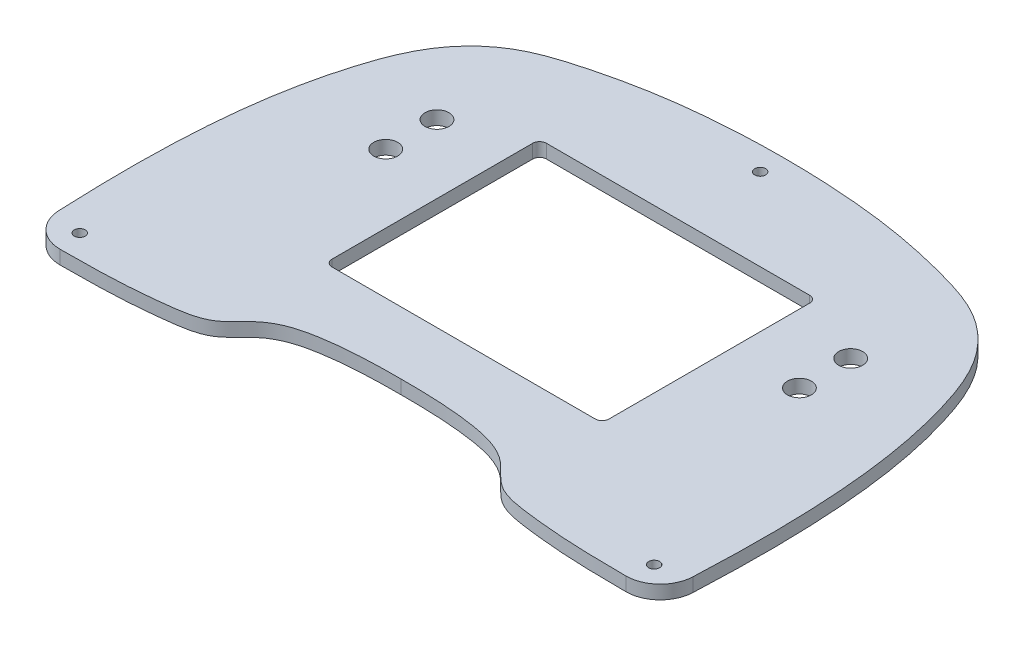
ISO-10303-21;
HEADER;
FILE_DESCRIPTION(('STEP AP214'),'2;1');
FILE_NAME('part.step','',(''),(''),'','','');
FILE_SCHEMA(('AUTOMOTIVE_DESIGN { 1 0 10303 214 1 1 1 1 }'));
ENDSEC;
DATA;
#1=APPLICATION_CONTEXT('core data for automotive mechanical design processes');
#2=APPLICATION_PROTOCOL_DEFINITION('international standard','automotive_design',2000,#1);
#3=PRODUCT_CONTEXT('',#1,'mechanical');
#4=PRODUCT('Part','Part','',(#3));
#5=PRODUCT_RELATED_PRODUCT_CATEGORY('part','',(#4));
#6=PRODUCT_DEFINITION_FORMATION('','',#4);
#7=PRODUCT_DEFINITION_CONTEXT('part definition',#1,'design');
#8=PRODUCT_DEFINITION('design','',#6,#7);
#9=PRODUCT_DEFINITION_SHAPE('','',#8);
#10=(LENGTH_UNIT() NAMED_UNIT(*) SI_UNIT(.MILLI.,.METRE.));
#11=(NAMED_UNIT(*) PLANE_ANGLE_UNIT() SI_UNIT($,.RADIAN.));
#12=(NAMED_UNIT(*) SI_UNIT($,.STERADIAN.) SOLID_ANGLE_UNIT());
#13=UNCERTAINTY_MEASURE_WITH_UNIT(LENGTH_MEASURE(1.E-05),#10,'distance_accuracy_value','');
#14=(GEOMETRIC_REPRESENTATION_CONTEXT(3) GLOBAL_UNCERTAINTY_ASSIGNED_CONTEXT((#13)) GLOBAL_UNIT_ASSIGNED_CONTEXT((#10,
#11,#12)) REPRESENTATION_CONTEXT('',''));
#15=CARTESIAN_POINT('',(0.,0.,0.));
#16=DIRECTION('',(0.,0.,1.));
#17=DIRECTION('',(1.,0.,0.));
#18=AXIS2_PLACEMENT_3D('',#15,#16,#17);
#19=CARTESIAN_POINT('',(0.,0.,0.));
#20=DIRECTION('',(0.,-1.,0.));
#21=DIRECTION('',(0.,0.,-1.));
#22=AXIS2_PLACEMENT_3D('',#19,#20,#21);
#23=PLANE('',#22);
#24=CARTESIAN_POINT('',(-60.5,0.,-97.97));
#25=DIRECTION('',(0.,1.,0.));
#26=DIRECTION('',(0.,0.,-1.));
#27=AXIS2_PLACEMENT_3D('',#24,#25,#26);
#28=CIRCLE('',#27,3.50000000000001);
#29=CARTESIAN_POINT('',(-60.5,0.,-101.47));
#30=VERTEX_POINT('',#29);
#31=EDGE_CURVE('E720',#30,#30,#28,.T.);
#32=ORIENTED_EDGE('',*,*,#31,.T.);
#33=EDGE_LOOP('',(#32));
#34=FACE_BOUND('',#33,.T.);
#35=CARTESIAN_POINT('',(60.5000000000002,0.,-82.97));
#36=DIRECTION('',(0.,1.,0.));
#37=DIRECTION('',(0.,0.,1.));
#38=AXIS2_PLACEMENT_3D('',#35,#36,#37);
#39=CIRCLE('',#38,3.5);
#40=CARTESIAN_POINT('',(60.5000000000002,0.,-79.47));
#41=VERTEX_POINT('',#40);
#42=EDGE_CURVE('E711',#41,#41,#39,.T.);
#43=ORIENTED_EDGE('',*,*,#42,.T.);
#44=EDGE_LOOP('',(#43));
#45=FACE_BOUND('',#44,.T.);
#46=CARTESIAN_POINT('',(-60.5000000000002,0.,-82.97));
#47=DIRECTION('',(0.,1.,0.));
#48=DIRECTION('',(0.,0.,-1.));
#49=AXIS2_PLACEMENT_3D('',#46,#47,#48);
#50=CIRCLE('',#49,3.5);
#51=CARTESIAN_POINT('',(-60.5000000000002,0.,-86.47));
#52=VERTEX_POINT('',#51);
#53=EDGE_CURVE('E727',#52,#52,#50,.T.);
#54=ORIENTED_EDGE('',*,*,#53,.T.);
#55=EDGE_LOOP('',(#54));
#56=FACE_BOUND('',#55,.T.);
#57=CARTESIAN_POINT('',(60.5,0.,-97.97));
#58=DIRECTION('',(0.,1.,0.));
#59=DIRECTION('',(0.,0.,1.));
#60=AXIS2_PLACEMENT_3D('',#57,#58,#59);
#61=CIRCLE('',#60,3.50000000000001);
#62=CARTESIAN_POINT('',(60.5,0.,-94.47));
#63=VERTEX_POINT('',#62);
#64=EDGE_CURVE('E612',#63,#63,#61,.T.);
#65=ORIENTED_EDGE('',*,*,#64,.T.);
#66=EDGE_LOOP('',(#65));
#67=FACE_BOUND('',#66,.T.);
#68=CARTESIAN_POINT('',(-84.,0.,-17.));
#69=DIRECTION('',(0.,1.,0.));
#70=DIRECTION('',(0.,0.,1.));
#71=AXIS2_PLACEMENT_3D('',#68,#69,#70);
#72=CIRCLE('',#71,1.6);
#73=CARTESIAN_POINT('',(-84.,0.,-15.4));
#74=VERTEX_POINT('',#73);
#75=EDGE_CURVE('E620',#74,#74,#72,.T.);
#76=ORIENTED_EDGE('',*,*,#75,.T.);
#77=EDGE_LOOP('',(#76));
#78=FACE_BOUND('',#77,.T.);
#79=CARTESIAN_POINT('',(84.,0.,-17.));
#80=DIRECTION('',(0.,1.,0.));
#81=DIRECTION('',(0.,0.,1.));
#82=AXIS2_PLACEMENT_3D('',#79,#80,#81);
#83=CIRCLE('',#82,1.6);
#84=CARTESIAN_POINT('',(84.,0.,-15.4));
#85=VERTEX_POINT('',#84);
#86=EDGE_CURVE('E604',#85,#85,#83,.T.);
#87=ORIENTED_EDGE('',*,*,#86,.T.);
#88=EDGE_LOOP('',(#87));
#89=FACE_BOUND('',#88,.T.);
#90=CARTESIAN_POINT('',(0.,0.,-132.));
#91=DIRECTION('',(0.,-1.,0.));
#92=DIRECTION('',(0.,0.,-1.));
#93=AXIS2_PLACEMENT_3D('',#90,#91,#92);
#94=CIRCLE('',#93,1.59999999999999);
#95=CARTESIAN_POINT('',(0.,0.,-133.6));
#96=VERTEX_POINT('',#95);
#97=EDGE_CURVE('E469',#96,#96,#94,.T.);
#98=ORIENTED_EDGE('',*,*,#97,.F.);
#99=EDGE_LOOP('',(#98));
#100=FACE_BOUND('',#99,.T.);
#101=CARTESIAN_POINT('',(92.2335145068298,0.,-9.99999999999992));
#102=CARTESIAN_POINT('',(93.1090313055752,0.,-24.461653992885));
#103=CARTESIAN_POINT('',(94.1412976787401,0.,-55.9294278930205));
#104=CARTESIAN_POINT('',(89.8487997363687,0.,-89.0425351081658));
#105=CARTESIAN_POINT('',(82.7766183598568,0.,-109.219212765688));
#106=CARTESIAN_POINT('',(77.5057588749509,0.,-118.879248593149));
#107=CARTESIAN_POINT('',(67.5606743100797,0.,-127.964233668267));
#108=CARTESIAN_POINT('',(51.2025143300991,0.,-133.204450958364));
#109=CARTESIAN_POINT('',(28.9563277305296,0.,-138.000468292935));
#110=CARTESIAN_POINT('',(10.5008714660227,0.,-139.));
#111=CARTESIAN_POINT('',(0.,0.,-139.));
#112=B_SPLINE_CURVE_WITH_KNOTS('',3,(#101,#102,#103,#104,#105,#106,#107,#108,#109,#110,#111),
.UNSPECIFIED.,.F.,.F.,(4,1,1,1,1,1,1,1,4),(0.048683264924351,0.273512027245697,
0.499348707548917,0.541604418075915,0.589205487808775,0.661188987966892,0.734095028903621,
0.840040992214581,1.),.UNSPECIFIED.);
#113=CARTESIAN_POINT('',(0.,0.,-139.));
#114=VERTEX_POINT('',#113);
#115=CARTESIAN_POINT('',(92.7421838232833,0.,-19.5419697216967));
#116=VERTEX_POINT('',#115);
#117=EDGE_CURVE('E494',#114,#116,#112,.F.);
#118=ORIENTED_EDGE('',*,*,#117,.T.);
#119=CARTESIAN_POINT('',(82.7525074101446,0.,-19.9962440449628));
#120=DIRECTION('',(0.,-1.,0.));
#121=DIRECTION('',(0.,0.,-1.));
#122=AXIS2_PLACEMENT_3D('',#119,#120,#121);
#123=CIRCLE('',#122,10.);
#124=CARTESIAN_POINT('',(82.730131227239,0.,-9.9962690796722));
#125=VERTEX_POINT('',#124);
#126=EDGE_CURVE('E522',#116,#125,#123,.T.);
#127=ORIENTED_EDGE('',*,*,#126,.T.);
#128=CARTESIAN_POINT('',(92.2335145068298,0.,-9.99999999999993));
#129=CARTESIAN_POINT('',(80.6643013871117,0.,-9.99999999999993));
#130=CARTESIAN_POINT('',(67.3797546573043,0.,-9.83297634828211));
#131=CARTESIAN_POINT('',(50.8212813424914,0.,-11.7564459144532));
#132=CARTESIAN_POINT('',(41.6876400077974,0.,-13.09279348235));
#133=CARTESIAN_POINT('',(34.6105420896924,0.,-23.0328201001358));
#134=CARTESIAN_POINT('',(19.1579227536028,0.,-26.7732538807536));
#135=CARTESIAN_POINT('',(6.71734960168822,0.,-26.9999999999999));
#136=CARTESIAN_POINT('',(0.,0.,-26.9999999999999));
#137=B_SPLINE_CURVE_WITH_KNOTS('',3,(#128,#129,#130,#131,#132,#133,#134,#135,#136),
.UNSPECIFIED.,.F.,.F.,(4,1,1,1,1,1,4),(0.,0.354854857166383,0.417368962198801,0.52508950542856,
0.626100692192997,0.774450144496227,1.),.UNSPECIFIED.);
#138=CARTESIAN_POINT('',(0.,0.,-26.9999999999999));
#139=VERTEX_POINT('',#138);
#140=EDGE_CURVE('E473',#139,#125,#137,.F.);
#141=ORIENTED_EDGE('',*,*,#140,.F.);
#142=CARTESIAN_POINT('',(-92.2335145068298,0.,-9.99999999999993));
#143=CARTESIAN_POINT('',(-80.6643013871117,0.,-9.99999999999993));
#144=CARTESIAN_POINT('',(-67.3797546573043,0.,-9.83297634828211));
#145=CARTESIAN_POINT('',(-50.8212813424914,0.,-11.7564459144532));
#146=CARTESIAN_POINT('',(-41.6876400077974,0.,-13.09279348235));
#147=CARTESIAN_POINT('',(-34.6105420896924,0.,-23.0328201001358));
#148=CARTESIAN_POINT('',(-19.1579227536028,0.,-26.7732538807536));
#149=CARTESIAN_POINT('',(-6.71734960168822,0.,-26.9999999999999));
#150=CARTESIAN_POINT('',(0.,0.,-26.9999999999999));
#151=B_SPLINE_CURVE_WITH_KNOTS('',3,(#142,#143,#144,#145,#146,#147,#148,#149,#150),
.UNSPECIFIED.,.F.,.F.,(4,1,1,1,1,1,4),(0.,0.354854857166383,0.417368962198801,0.52508950542856,
0.626100692192997,0.774450144496227,1.),.UNSPECIFIED.);
#152=CARTESIAN_POINT('',(-82.730131227239,0.,-9.9962690796722));
#153=VERTEX_POINT('',#152);
#154=EDGE_CURVE('E461',#139,#153,#151,.F.);
#155=ORIENTED_EDGE('',*,*,#154,.T.);
#156=CARTESIAN_POINT('',(-82.7525074101446,0.,-19.9962440449628));
#157=DIRECTION('',(0.,-1.,0.));
#158=DIRECTION('',(0.,0.,-1.));
#159=AXIS2_PLACEMENT_3D('',#156,#157,#158);
#160=CIRCLE('',#159,10.);
#161=CARTESIAN_POINT('',(-92.7421838232834,0.,-19.5419697216967));
#162=VERTEX_POINT('',#161);
#163=EDGE_CURVE('E519',#153,#162,#160,.T.);
#164=ORIENTED_EDGE('',*,*,#163,.T.);
#165=CARTESIAN_POINT('',(-92.2335145068298,0.,-9.99999999999992));
#166=CARTESIAN_POINT('',(-93.1090313055752,0.,-24.461653992885));
#167=CARTESIAN_POINT('',(-94.1412976787401,0.,-55.9294278930205));
#168=CARTESIAN_POINT('',(-89.8487997363687,0.,-89.0425351081658));
#169=CARTESIAN_POINT('',(-82.7766183598568,0.,-109.219212765688));
#170=CARTESIAN_POINT('',(-77.5057588749509,0.,-118.879248593149));
#171=CARTESIAN_POINT('',(-67.5606743100797,0.,-127.964233668267));
#172=CARTESIAN_POINT('',(-51.2025143300991,0.,-133.204450958364));
#173=CARTESIAN_POINT('',(-28.9563277305296,0.,-138.000468292935));
#174=CARTESIAN_POINT('',(-10.5008714660227,0.,-139.));
#175=CARTESIAN_POINT('',(0.,0.,-139.));
#176=B_SPLINE_CURVE_WITH_KNOTS('',3,(#165,#166,#167,#168,#169,#170,#171,#172,#173,#174,#175),
.UNSPECIFIED.,.F.,.F.,(4,1,1,1,1,1,1,1,4),(0.048683264924351,0.273512027245697,
0.499348707548917,0.541604418075915,0.589205487808775,0.661188987966892,0.734095028903621,
0.840040992214581,1.),.UNSPECIFIED.);
#177=EDGE_CURVE('E485',#114,#162,#176,.F.);
#178=ORIENTED_EDGE('',*,*,#177,.F.);
#179=EDGE_LOOP('',(#118,#127,#141,#155,#164,#178));
#180=FACE_BOUND('',#179,.T.);
#181=DIRECTION('',(-1.,0.,0.));
#182=VECTOR('',#181,1.);
#183=CARTESIAN_POINT('',(0.,0.,-107.97));
#184=LINE('',#183,#182);
#185=CARTESIAN_POINT('',(38.5,0.,-107.97));
#186=VERTEX_POINT('',#185);
#187=CARTESIAN_POINT('',(-38.5,0.,-107.97));
#188=VERTEX_POINT('',#187);
#189=EDGE_CURVE('E592',#186,#188,#184,.T.);
#190=ORIENTED_EDGE('',*,*,#189,.T.);
#191=CARTESIAN_POINT('',(-38.5,0.,-105.97));
#192=DIRECTION('',(0.,-1.,0.));
#193=DIRECTION('',(0.,0.,-1.));
#194=AXIS2_PLACEMENT_3D('',#191,#192,#193);
#195=CIRCLE('',#194,2.);
#196=CARTESIAN_POINT('',(-40.5,0.,-105.97));
#197=VERTEX_POINT('',#196);
#198=EDGE_CURVE('E568',#188,#197,#195,.F.);
#199=ORIENTED_EDGE('',*,*,#198,.T.);
#200=DIRECTION('',(0.,0.,1.));
#201=VECTOR('',#200,1.);
#202=CARTESIAN_POINT('',(-40.5,0.,0.));
#203=LINE('',#202,#201);
#204=CARTESIAN_POINT('',(-40.5,0.,-47.27));
#205=VERTEX_POINT('',#204);
#206=EDGE_CURVE('E599',#197,#205,#203,.T.);
#207=ORIENTED_EDGE('',*,*,#206,.T.);
#208=CARTESIAN_POINT('',(-38.5,0.,-47.27));
#209=DIRECTION('',(0.,-1.,0.));
#210=DIRECTION('',(0.,0.,-1.));
#211=AXIS2_PLACEMENT_3D('',#208,#209,#210);
#212=CIRCLE('',#211,2.);
#213=CARTESIAN_POINT('',(-38.5,0.,-45.2699999999999));
#214=VERTEX_POINT('',#213);
#215=EDGE_CURVE('E562',#205,#214,#212,.F.);
#216=ORIENTED_EDGE('',*,*,#215,.T.);
#217=DIRECTION('',(-1.,0.,0.));
#218=VECTOR('',#217,1.);
#219=CARTESIAN_POINT('',(0.,0.,-45.2699999999999));
#220=LINE('',#219,#218);
#221=CARTESIAN_POINT('',(38.5,0.,-45.2699999999999));
#222=VERTEX_POINT('',#221);
#223=EDGE_CURVE('E606',#222,#214,#220,.T.);
#224=ORIENTED_EDGE('',*,*,#223,.F.);
#225=CARTESIAN_POINT('',(38.5,0.,-47.27));
#226=DIRECTION('',(0.,-1.,0.));
#227=DIRECTION('',(0.,0.,-1.));
#228=AXIS2_PLACEMENT_3D('',#225,#226,#227);
#229=CIRCLE('',#228,2.);
#230=CARTESIAN_POINT('',(40.5,0.,-47.27));
#231=VERTEX_POINT('',#230);
#232=EDGE_CURVE('E348',#222,#231,#229,.F.);
#233=ORIENTED_EDGE('',*,*,#232,.T.);
#234=DIRECTION('',(0.,0.,1.));
#235=VECTOR('',#234,1.);
#236=CARTESIAN_POINT('',(40.5,0.,0.));
#237=LINE('',#236,#235);
#238=CARTESIAN_POINT('',(40.5,0.,-105.97));
#239=VERTEX_POINT('',#238);
#240=EDGE_CURVE('E594',#239,#231,#237,.T.);
#241=ORIENTED_EDGE('',*,*,#240,.F.);
#242=CARTESIAN_POINT('',(38.5,0.,-105.97));
#243=DIRECTION('',(0.,-1.,0.));
#244=DIRECTION('',(0.,0.,-1.));
#245=AXIS2_PLACEMENT_3D('',#242,#243,#244);
#246=CIRCLE('',#245,2.);
#247=EDGE_CURVE('E12',#239,#186,#246,.F.);
#248=ORIENTED_EDGE('',*,*,#247,.T.);
#249=EDGE_LOOP('',(#190,#199,#207,#216,#224,#233,#241,#248));
#250=FACE_BOUND('',#249,.T.);
#251=ADVANCED_FACE('F332',(#34,#45,#56,#67,#78,#89,#100,#180,#250),#23,.T.);
#252=CARTESIAN_POINT('',(0.,4.,0.));
#253=DIRECTION('',(0.,-1.,0.));
#254=DIRECTION('',(0.,0.,-1.));
#255=AXIS2_PLACEMENT_3D('',#252,#253,#254);
#256=PLANE('',#255);
#257=CARTESIAN_POINT('',(-60.5,4.,-97.97));
#258=DIRECTION('',(0.,1.,0.));
#259=DIRECTION('',(0.,0.,-1.));
#260=AXIS2_PLACEMENT_3D('',#257,#258,#259);
#261=CIRCLE('',#260,3.50000000000001);
#262=CARTESIAN_POINT('',(-60.5,4.,-101.47));
#263=VERTEX_POINT('',#262);
#264=EDGE_CURVE('E707',#263,#263,#261,.T.);
#265=ORIENTED_EDGE('',*,*,#264,.F.);
#266=EDGE_LOOP('',(#265));
#267=FACE_BOUND('',#266,.T.);
#268=CARTESIAN_POINT('',(60.5000000000002,4.,-82.97));
#269=DIRECTION('',(0.,1.,0.));
#270=DIRECTION('',(0.,0.,1.));
#271=AXIS2_PLACEMENT_3D('',#268,#269,#270);
#272=CIRCLE('',#271,3.5);
#273=CARTESIAN_POINT('',(60.5000000000002,4.,-79.47));
#274=VERTEX_POINT('',#273);
#275=EDGE_CURVE('E715',#274,#274,#272,.T.);
#276=ORIENTED_EDGE('',*,*,#275,.F.);
#277=EDGE_LOOP('',(#276));
#278=FACE_BOUND('',#277,.T.);
#279=CARTESIAN_POINT('',(-60.5000000000002,4.,-82.97));
#280=DIRECTION('',(0.,1.,0.));
#281=DIRECTION('',(0.,0.,-1.));
#282=AXIS2_PLACEMENT_3D('',#279,#280,#281);
#283=CIRCLE('',#282,3.5);
#284=CARTESIAN_POINT('',(-60.5000000000002,4.,-86.47));
#285=VERTEX_POINT('',#284);
#286=EDGE_CURVE('E716',#285,#285,#283,.T.);
#287=ORIENTED_EDGE('',*,*,#286,.F.);
#288=EDGE_LOOP('',(#287));
#289=FACE_BOUND('',#288,.T.);
#290=CARTESIAN_POINT('',(60.5,4.,-97.97));
#291=DIRECTION('',(0.,1.,0.));
#292=DIRECTION('',(0.,0.,1.));
#293=AXIS2_PLACEMENT_3D('',#290,#291,#292);
#294=CIRCLE('',#293,3.50000000000001);
#295=CARTESIAN_POINT('',(60.5,4.,-94.47));
#296=VERTEX_POINT('',#295);
#297=EDGE_CURVE('E703',#296,#296,#294,.T.);
#298=ORIENTED_EDGE('',*,*,#297,.F.);
#299=EDGE_LOOP('',(#298));
#300=FACE_BOUND('',#299,.T.);
#301=CARTESIAN_POINT('',(92.2335145068298,4.,-9.99999999999993));
#302=CARTESIAN_POINT('',(80.6643013871117,4.,-9.99999999999993));
#303=CARTESIAN_POINT('',(67.3797546573043,4.,-9.83297634828211));
#304=CARTESIAN_POINT('',(50.8212813424914,4.,-11.7564459144532));
#305=CARTESIAN_POINT('',(41.6876400077974,4.,-13.09279348235));
#306=CARTESIAN_POINT('',(34.6105420896924,4.,-23.0328201001358));
#307=CARTESIAN_POINT('',(19.1579227536028,4.,-26.7732538807536));
#308=CARTESIAN_POINT('',(6.71734960168822,4.,-26.9999999999999));
#309=CARTESIAN_POINT('',(0.,4.,-26.9999999999999));
#310=B_SPLINE_CURVE_WITH_KNOTS('',3,(#301,#302,#303,#304,#305,#306,#307,#308,#309),
.UNSPECIFIED.,.F.,.F.,(4,1,1,1,1,1,4),(0.,0.354854857166383,0.417368962198801,0.52508950542856,
0.626100692192997,0.774450144496227,1.),.UNSPECIFIED.);
#311=CARTESIAN_POINT('',(82.730131227239,4.,-9.9962690796722));
#312=VERTEX_POINT('',#311);
#313=CARTESIAN_POINT('',(0.,4.,-26.9999999999999));
#314=VERTEX_POINT('',#313);
#315=EDGE_CURVE('E439',#312,#314,#310,.T.);
#316=ORIENTED_EDGE('',*,*,#315,.F.);
#317=CARTESIAN_POINT('',(82.7525074101446,4.,-19.9962440449628));
#318=DIRECTION('',(0.,-1.,0.));
#319=DIRECTION('',(0.,0.,-1.));
#320=AXIS2_PLACEMENT_3D('',#317,#318,#319);
#321=CIRCLE('',#320,10.);
#322=CARTESIAN_POINT('',(92.7421838232833,4.,-19.5419697216967));
#323=VERTEX_POINT('',#322);
#324=EDGE_CURVE('E513',#312,#323,#321,.F.);
#325=ORIENTED_EDGE('',*,*,#324,.T.);
#326=CARTESIAN_POINT('',(92.2335145068298,4.,-9.99999999999992));
#327=CARTESIAN_POINT('',(93.1090313055752,4.,-24.461653992885));
#328=CARTESIAN_POINT('',(94.1412976787401,4.,-55.9294278930205));
#329=CARTESIAN_POINT('',(89.8487997363687,4.,-89.0425351081658));
#330=CARTESIAN_POINT('',(82.7766183598568,4.,-109.219212765688));
#331=CARTESIAN_POINT('',(77.5057588749509,4.,-118.879248593149));
#332=CARTESIAN_POINT('',(67.5606743100797,4.,-127.964233668267));
#333=CARTESIAN_POINT('',(51.2025143300991,4.,-133.204450958364));
#334=CARTESIAN_POINT('',(28.9563277305296,4.,-138.000468292935));
#335=CARTESIAN_POINT('',(10.5008714660227,4.,-139.));
#336=CARTESIAN_POINT('',(0.,4.,-139.));
#337=B_SPLINE_CURVE_WITH_KNOTS('',3,(#326,#327,#328,#329,#330,#331,#332,#333,#334,#335,#336),
.UNSPECIFIED.,.F.,.F.,(4,1,1,1,1,1,1,1,4),(0.048683264924351,0.273512027245697,
0.499348707548917,0.541604418075915,0.589205487808775,0.661188987966892,0.734095028903621,
0.840040992214581,1.),.UNSPECIFIED.);
#338=CARTESIAN_POINT('',(0.,4.,-139.));
#339=VERTEX_POINT('',#338);
#340=EDGE_CURVE('E457',#323,#339,#337,.T.);
#341=ORIENTED_EDGE('',*,*,#340,.T.);
#342=CARTESIAN_POINT('',(-92.2335145068298,4.,-9.99999999999992));
#343=CARTESIAN_POINT('',(-93.1090313055752,4.,-24.461653992885));
#344=CARTESIAN_POINT('',(-94.1412976787401,4.,-55.9294278930205));
#345=CARTESIAN_POINT('',(-89.8487997363687,4.,-89.0425351081658));
#346=CARTESIAN_POINT('',(-82.7766183598568,4.,-109.219212765688));
#347=CARTESIAN_POINT('',(-77.5057588749509,4.,-118.879248593149));
#348=CARTESIAN_POINT('',(-67.5606743100797,4.,-127.964233668267));
#349=CARTESIAN_POINT('',(-51.2025143300991,4.,-133.204450958364));
#350=CARTESIAN_POINT('',(-28.9563277305296,4.,-138.000468292935));
#351=CARTESIAN_POINT('',(-10.5008714660227,4.,-139.));
#352=CARTESIAN_POINT('',(0.,4.,-139.));
#353=B_SPLINE_CURVE_WITH_KNOTS('',3,(#342,#343,#344,#345,#346,#347,#348,#349,#350,#351,#352),
.UNSPECIFIED.,.F.,.F.,(4,1,1,1,1,1,1,1,4),(0.048683264924351,0.273512027245697,
0.499348707548917,0.541604418075915,0.589205487808775,0.661188987966892,0.734095028903621,
0.840040992214581,1.),.UNSPECIFIED.);
#354=CARTESIAN_POINT('',(-92.7421838232834,4.,-19.5419697216967));
#355=VERTEX_POINT('',#354);
#356=EDGE_CURVE('E446',#355,#339,#353,.T.);
#357=ORIENTED_EDGE('',*,*,#356,.F.);
#358=CARTESIAN_POINT('',(-82.7525074101446,4.,-19.9962440449628));
#359=DIRECTION('',(0.,-1.,0.));
#360=DIRECTION('',(0.,0.,-1.));
#361=AXIS2_PLACEMENT_3D('',#358,#359,#360);
#362=CIRCLE('',#361,10.);
#363=CARTESIAN_POINT('',(-82.730131227239,4.,-9.9962690796722));
#364=VERTEX_POINT('',#363);
#365=EDGE_CURVE('E441',#355,#364,#362,.F.);
#366=ORIENTED_EDGE('',*,*,#365,.T.);
#367=CARTESIAN_POINT('',(-92.2335145068298,4.,-9.99999999999993));
#368=CARTESIAN_POINT('',(-80.6643013871117,4.,-9.99999999999993));
#369=CARTESIAN_POINT('',(-67.3797546573043,4.,-9.83297634828211));
#370=CARTESIAN_POINT('',(-50.8212813424914,4.,-11.7564459144532));
#371=CARTESIAN_POINT('',(-41.6876400077974,4.,-13.09279348235));
#372=CARTESIAN_POINT('',(-34.6105420896924,4.,-23.0328201001358));
#373=CARTESIAN_POINT('',(-19.1579227536028,4.,-26.7732538807536));
#374=CARTESIAN_POINT('',(-6.71734960168822,4.,-26.9999999999999));
#375=CARTESIAN_POINT('',(0.,4.,-26.9999999999999));
#376=B_SPLINE_CURVE_WITH_KNOTS('',3,(#367,#368,#369,#370,#371,#372,#373,#374,#375),
.UNSPECIFIED.,.F.,.F.,(4,1,1,1,1,1,4),(0.,0.354854857166383,0.417368962198801,0.52508950542856,
0.626100692192997,0.774450144496227,1.),.UNSPECIFIED.);
#377=EDGE_CURVE('E435',#364,#314,#376,.T.);
#378=ORIENTED_EDGE('',*,*,#377,.T.);
#379=EDGE_LOOP('',(#316,#325,#341,#357,#366,#378));
#380=FACE_BOUND('',#379,.T.);
#381=CARTESIAN_POINT('',(0.,4.,-132.));
#382=DIRECTION('',(0.,1.,0.));
#383=DIRECTION('',(0.,0.,1.));
#384=AXIS2_PLACEMENT_3D('',#381,#382,#383);
#385=CIRCLE('',#384,1.59999999999999);
#386=CARTESIAN_POINT('',(0.,4.,-130.4));
#387=VERTEX_POINT('',#386);
#388=EDGE_CURVE('E624',#387,#387,#385,.T.);
#389=ORIENTED_EDGE('',*,*,#388,.F.);
#390=EDGE_LOOP('',(#389));
#391=FACE_BOUND('',#390,.T.);
#392=CARTESIAN_POINT('',(84.,4.,-17.));
#393=DIRECTION('',(0.,1.,0.));
#394=DIRECTION('',(0.,0.,1.));
#395=AXIS2_PLACEMENT_3D('',#392,#393,#394);
#396=CIRCLE('',#395,1.6);
#397=CARTESIAN_POINT('',(84.,4.,-15.4));
#398=VERTEX_POINT('',#397);
#399=EDGE_CURVE('E629',#398,#398,#396,.T.);
#400=ORIENTED_EDGE('',*,*,#399,.F.);
#401=EDGE_LOOP('',(#400));
#402=FACE_BOUND('',#401,.T.);
#403=CARTESIAN_POINT('',(-84.,4.,-17.));
#404=DIRECTION('',(0.,1.,0.));
#405=DIRECTION('',(0.,0.,1.));
#406=AXIS2_PLACEMENT_3D('',#403,#404,#405);
#407=CIRCLE('',#406,1.6);
#408=CARTESIAN_POINT('',(-84.,4.,-15.4));
#409=VERTEX_POINT('',#408);
#410=EDGE_CURVE('E625',#409,#409,#407,.T.);
#411=ORIENTED_EDGE('',*,*,#410,.F.);
#412=EDGE_LOOP('',(#411));
#413=FACE_BOUND('',#412,.T.);
#414=DIRECTION('',(0.,0.,1.));
#415=VECTOR('',#414,1.);
#416=CARTESIAN_POINT('',(40.5,4.,0.));
#417=LINE('',#416,#415);
#418=CARTESIAN_POINT('',(40.5,4.,-105.97));
#419=VERTEX_POINT('',#418);
#420=CARTESIAN_POINT('',(40.5,4.,-47.27));
#421=VERTEX_POINT('',#420);
#422=EDGE_CURVE('E579',#419,#421,#417,.T.);
#423=ORIENTED_EDGE('',*,*,#422,.T.);
#424=CARTESIAN_POINT('',(38.5,4.,-47.27));
#425=DIRECTION('',(0.,-1.,0.));
#426=DIRECTION('',(0.,0.,-1.));
#427=AXIS2_PLACEMENT_3D('',#424,#425,#426);
#428=CIRCLE('',#427,2.);
#429=CARTESIAN_POINT('',(38.5,4.,-45.2699999999999));
#430=VERTEX_POINT('',#429);
#431=EDGE_CURVE('E571',#421,#430,#428,.T.);
#432=ORIENTED_EDGE('',*,*,#431,.T.);
#433=DIRECTION('',(-1.,0.,0.));
#434=VECTOR('',#433,1.);
#435=CARTESIAN_POINT('',(0.,4.,-45.2699999999999));
#436=LINE('',#435,#434);
#437=CARTESIAN_POINT('',(-38.5,4.,-45.2699999999999));
#438=VERTEX_POINT('',#437);
#439=EDGE_CURVE('E587',#430,#438,#436,.T.);
#440=ORIENTED_EDGE('',*,*,#439,.T.);
#441=CARTESIAN_POINT('',(-38.5,4.,-47.27));
#442=DIRECTION('',(0.,-1.,0.));
#443=DIRECTION('',(0.,0.,-1.));
#444=AXIS2_PLACEMENT_3D('',#441,#442,#443);
#445=CIRCLE('',#444,2.);
#446=CARTESIAN_POINT('',(-40.5,4.,-47.27));
#447=VERTEX_POINT('',#446);
#448=EDGE_CURVE('E559',#438,#447,#445,.T.);
#449=ORIENTED_EDGE('',*,*,#448,.T.);
#450=DIRECTION('',(0.,0.,1.));
#451=VECTOR('',#450,1.);
#452=CARTESIAN_POINT('',(-40.5,4.,0.));
#453=LINE('',#452,#451);
#454=CARTESIAN_POINT('',(-40.5,4.,-105.97));
#455=VERTEX_POINT('',#454);
#456=EDGE_CURVE('E616',#455,#447,#453,.T.);
#457=ORIENTED_EDGE('',*,*,#456,.F.);
#458=CARTESIAN_POINT('',(-38.5,4.,-105.97));
#459=DIRECTION('',(0.,-1.,0.));
#460=DIRECTION('',(0.,0.,-1.));
#461=AXIS2_PLACEMENT_3D('',#458,#459,#460);
#462=CIRCLE('',#461,2.);
#463=CARTESIAN_POINT('',(-38.5,4.,-107.97));
#464=VERTEX_POINT('',#463);
#465=EDGE_CURVE('E565',#455,#464,#462,.T.);
#466=ORIENTED_EDGE('',*,*,#465,.T.);
#467=DIRECTION('',(-1.,0.,0.));
#468=VECTOR('',#467,1.);
#469=CARTESIAN_POINT('',(0.,4.,-107.97));
#470=LINE('',#469,#468);
#471=CARTESIAN_POINT('',(38.5,4.,-107.97));
#472=VERTEX_POINT('',#471);
#473=EDGE_CURVE('E581',#472,#464,#470,.T.);
#474=ORIENTED_EDGE('',*,*,#473,.F.);
#475=CARTESIAN_POINT('',(38.5,4.,-105.97));
#476=DIRECTION('',(0.,-1.,0.));
#477=DIRECTION('',(0.,0.,-1.));
#478=AXIS2_PLACEMENT_3D('',#475,#476,#477);
#479=CIRCLE('',#478,2.);
#480=EDGE_CURVE('E341',#472,#419,#479,.T.);
#481=ORIENTED_EDGE('',*,*,#480,.T.);
#482=EDGE_LOOP('',(#423,#432,#440,#449,#457,#466,#474,#481));
#483=FACE_BOUND('',#482,.T.);
#484=ADVANCED_FACE('F437',(#267,#278,#289,#300,#380,#391,#402,#413,#483),#256,.F.);
#485=CARTESIAN_POINT('',(92.2335145068298,-1.,-9.99999999999992));
#486=CARTESIAN_POINT('',(93.1090313055752,-1.,-24.461653992885));
#487=CARTESIAN_POINT('',(94.1412976787401,-1.,-55.9294278930205));
#488=CARTESIAN_POINT('',(89.8487997363687,-1.,-89.0425351081658));
#489=CARTESIAN_POINT('',(82.7766183598568,-1.,-109.219212765688));
#490=CARTESIAN_POINT('',(77.5057588749509,-1.,-118.879248593149));
#491=CARTESIAN_POINT('',(67.5606743100797,-1.,-127.964233668267));
#492=CARTESIAN_POINT('',(51.2025143300991,-1.,-133.204450958364));
#493=CARTESIAN_POINT('',(28.9563277305296,-1.,-138.000468292935));
#494=CARTESIAN_POINT('',(10.5008714660227,-1.,-139.));
#495=CARTESIAN_POINT('',(0.,-1.,-139.));
#496=B_SPLINE_CURVE_WITH_KNOTS('',3,(#485,#486,#487,#488,#489,#490,#491,#492,#493,#494,#495),
.UNSPECIFIED.,.F.,.F.,(4,1,1,1,1,1,1,1,4),(0.048683264924351,0.273512027245697,
0.499348707548917,0.541604418075915,0.589205487808775,0.661188987966892,0.734095028903621,
0.840040992214581,1.),.UNSPECIFIED.);
#497=DIRECTION('',(0.,1.,0.));
#498=VECTOR('',#497,1.);
#499=SURFACE_OF_LINEAR_EXTRUSION('',#496,#498);
#500=ORIENTED_EDGE('',*,*,#340,.F.);
#501=DIRECTION('',(0.,1.,0.));
#502=VECTOR('',#501,1.);
#503=CARTESIAN_POINT('',(92.7421838232834,4.,-19.5419697216967));
#504=LINE('',#503,#502);
#505=EDGE_CURVE('E516',#323,#116,#504,.F.);
#506=ORIENTED_EDGE('',*,*,#505,.T.);
#507=ORIENTED_EDGE('',*,*,#117,.F.);
#508=DIRECTION('',(0.,1.,0.));
#509=VECTOR('',#508,1.);
#510=CARTESIAN_POINT('',(0.,-1.,-139.));
#511=LINE('',#510,#509);
#512=EDGE_CURVE('E464',#114,#339,#511,.T.);
#513=ORIENTED_EDGE('',*,*,#512,.T.);
#514=EDGE_LOOP('',(#500,#506,#507,#513));
#515=FACE_BOUND('',#514,.T.);
#516=ADVANCED_FACE('F651',(#515),#499,.T.);
#517=CARTESIAN_POINT('',(-92.2335145068298,-1.,-9.99999999999992));
#518=CARTESIAN_POINT('',(-93.1090313055752,-1.,-24.461653992885));
#519=CARTESIAN_POINT('',(-94.1412976787401,-1.,-55.9294278930205));
#520=CARTESIAN_POINT('',(-89.8487997363687,-1.,-89.0425351081658));
#521=CARTESIAN_POINT('',(-82.7766183598568,-1.,-109.219212765688));
#522=CARTESIAN_POINT('',(-77.5057588749509,-1.,-118.879248593149));
#523=CARTESIAN_POINT('',(-67.5606743100797,-1.,-127.964233668267));
#524=CARTESIAN_POINT('',(-51.2025143300991,-1.,-133.204450958364));
#525=CARTESIAN_POINT('',(-28.9563277305296,-1.,-138.000468292935));
#526=CARTESIAN_POINT('',(-10.5008714660227,-1.,-139.));
#527=CARTESIAN_POINT('',(0.,-1.,-139.));
#528=B_SPLINE_CURVE_WITH_KNOTS('',3,(#517,#518,#519,#520,#521,#522,#523,#524,#525,#526,#527),
.UNSPECIFIED.,.F.,.F.,(4,1,1,1,1,1,1,1,4),(0.048683264924351,0.273512027245697,
0.499348707548917,0.541604418075915,0.589205487808775,0.661188987966892,0.734095028903621,
0.840040992214581,1.),.UNSPECIFIED.);
#529=DIRECTION('',(0.,1.,0.));
#530=VECTOR('',#529,1.);
#531=SURFACE_OF_LINEAR_EXTRUSION('',#528,#530);
#532=ORIENTED_EDGE('',*,*,#177,.T.);
#533=DIRECTION('',(0.,1.,0.));
#534=VECTOR('',#533,1.);
#535=CARTESIAN_POINT('',(-92.7421838232834,0.,-19.5419697216967));
#536=LINE('',#535,#534);
#537=EDGE_CURVE('E525',#162,#355,#536,.T.);
#538=ORIENTED_EDGE('',*,*,#537,.T.);
#539=ORIENTED_EDGE('',*,*,#356,.T.);
#540=ORIENTED_EDGE('',*,*,#512,.F.);
#541=EDGE_LOOP('',(#532,#538,#539,#540));
#542=FACE_BOUND('',#541,.T.);
#543=ADVANCED_FACE('F655',(#542),#531,.F.);
#544=CARTESIAN_POINT('',(-92.2335145068298,-1.,-9.99999999999993));
#545=CARTESIAN_POINT('',(-80.6643013871117,-1.,-9.99999999999993));
#546=CARTESIAN_POINT('',(-67.3797546573043,-1.,-9.83297634828211));
#547=CARTESIAN_POINT('',(-50.8212813424914,-1.,-11.7564459144532));
#548=CARTESIAN_POINT('',(-41.6876400077974,-1.,-13.09279348235));
#549=CARTESIAN_POINT('',(-34.6105420896924,-1.,-23.0328201001358));
#550=CARTESIAN_POINT('',(-19.1579227536028,-1.,-26.7732538807536));
#551=CARTESIAN_POINT('',(-6.71734960168822,-1.,-26.9999999999999));
#552=CARTESIAN_POINT('',(0.,-1.,-26.9999999999999));
#553=B_SPLINE_CURVE_WITH_KNOTS('',3,(#544,#545,#546,#547,#548,#549,#550,#551,#552),
.UNSPECIFIED.,.F.,.F.,(4,1,1,1,1,1,4),(0.,0.354854857166383,0.417368962198801,0.52508950542856,
0.626100692192997,0.774450144496227,1.),.UNSPECIFIED.);
#554=DIRECTION('',(0.,1.,0.));
#555=VECTOR('',#554,1.);
#556=SURFACE_OF_LINEAR_EXTRUSION('',#553,#555);
#557=ORIENTED_EDGE('',*,*,#377,.F.);
#558=DIRECTION('',(0.,1.,0.));
#559=VECTOR('',#558,1.);
#560=CARTESIAN_POINT('',(-82.730131227234,4.,-9.99626907967222));
#561=LINE('',#560,#559);
#562=EDGE_CURVE('E529',#364,#153,#561,.F.);
#563=ORIENTED_EDGE('',*,*,#562,.T.);
#564=ORIENTED_EDGE('',*,*,#154,.F.);
#565=DIRECTION('',(0.,1.,0.));
#566=VECTOR('',#565,1.);
#567=CARTESIAN_POINT('',(0.,-1.,-26.9999999999999));
#568=LINE('',#567,#566);
#569=EDGE_CURVE('E452',#139,#314,#568,.T.);
#570=ORIENTED_EDGE('',*,*,#569,.T.);
#571=EDGE_LOOP('',(#557,#563,#564,#570));
#572=FACE_BOUND('',#571,.T.);
#573=ADVANCED_FACE('F459',(#572),#556,.T.);
#574=CARTESIAN_POINT('',(92.2335145068298,-1.,-9.99999999999993));
#575=CARTESIAN_POINT('',(80.6643013871117,-1.,-9.99999999999993));
#576=CARTESIAN_POINT('',(67.3797546573043,-1.,-9.83297634828211));
#577=CARTESIAN_POINT('',(50.8212813424914,-1.,-11.7564459144532));
#578=CARTESIAN_POINT('',(41.6876400077974,-1.,-13.09279348235));
#579=CARTESIAN_POINT('',(34.6105420896924,-1.,-23.0328201001358));
#580=CARTESIAN_POINT('',(19.1579227536028,-1.,-26.7732538807536));
#581=CARTESIAN_POINT('',(6.71734960168822,-1.,-26.9999999999999));
#582=CARTESIAN_POINT('',(0.,-1.,-26.9999999999999));
#583=B_SPLINE_CURVE_WITH_KNOTS('',3,(#574,#575,#576,#577,#578,#579,#580,#581,#582),
.UNSPECIFIED.,.F.,.F.,(4,1,1,1,1,1,4),(0.,0.354854857166383,0.417368962198801,0.52508950542856,
0.626100692192997,0.774450144496227,1.),.UNSPECIFIED.);
#584=DIRECTION('',(0.,1.,0.));
#585=VECTOR('',#584,1.);
#586=SURFACE_OF_LINEAR_EXTRUSION('',#583,#585);
#587=ORIENTED_EDGE('',*,*,#140,.T.);
#588=DIRECTION('',(0.,1.,0.));
#589=VECTOR('',#588,1.);
#590=CARTESIAN_POINT('',(82.730131227234,0.,-9.99626907967222));
#591=LINE('',#590,#589);
#592=EDGE_CURVE('E455',#125,#312,#591,.T.);
#593=ORIENTED_EDGE('',*,*,#592,.T.);
#594=ORIENTED_EDGE('',*,*,#315,.T.);
#595=ORIENTED_EDGE('',*,*,#569,.F.);
#596=EDGE_LOOP('',(#587,#593,#594,#595));
#597=FACE_BOUND('',#596,.T.);
#598=ADVANCED_FACE('F451',(#597),#586,.F.);
#599=CARTESIAN_POINT('',(0.,-1.,-132.));
#600=DIRECTION('',(0.,1.,0.));
#601=DIRECTION('',(0.,0.,1.));
#602=AXIS2_PLACEMENT_3D('',#599,#600,#601);
#603=CYLINDRICAL_SURFACE('',#602,1.59999999999999);
#604=ORIENTED_EDGE('',*,*,#97,.T.);
#605=EDGE_LOOP('',(#604));
#606=FACE_BOUND('',#605,.T.);
#607=ORIENTED_EDGE('',*,*,#388,.T.);
#608=EDGE_LOOP('',(#607));
#609=FACE_BOUND('',#608,.T.);
#610=ADVANCED_FACE('F668',(#606,#609),#603,.F.);
#611=CARTESIAN_POINT('',(82.7525074101446,2.,-19.9962440449628));
#612=DIRECTION('',(0.,1.,0.));
#613=DIRECTION('',(0.,0.,1.));
#614=AXIS2_PLACEMENT_3D('',#611,#612,#613);
#615=CYLINDRICAL_SURFACE('',#614,10.);
#616=ORIENTED_EDGE('',*,*,#126,.F.);
#617=ORIENTED_EDGE('',*,*,#505,.F.);
#618=ORIENTED_EDGE('',*,*,#324,.F.);
#619=ORIENTED_EDGE('',*,*,#592,.F.);
#620=EDGE_LOOP('',(#616,#617,#618,#619));
#621=FACE_BOUND('',#620,.T.);
#622=ADVANCED_FACE('F664',(#621),#615,.T.);
#623=CARTESIAN_POINT('',(-82.7525074101446,2.,-19.9962440449628));
#624=DIRECTION('',(0.,1.,0.));
#625=DIRECTION('',(0.,0.,1.));
#626=AXIS2_PLACEMENT_3D('',#623,#624,#625);
#627=CYLINDRICAL_SURFACE('',#626,10.);
#628=ORIENTED_EDGE('',*,*,#163,.F.);
#629=ORIENTED_EDGE('',*,*,#562,.F.);
#630=ORIENTED_EDGE('',*,*,#365,.F.);
#631=ORIENTED_EDGE('',*,*,#537,.F.);
#632=EDGE_LOOP('',(#628,#629,#630,#631));
#633=FACE_BOUND('',#632,.T.);
#634=ADVANCED_FACE('F667',(#633),#627,.T.);
#635=CARTESIAN_POINT('',(84.,0.,-17.));
#636=DIRECTION('',(0.,1.,0.));
#637=DIRECTION('',(0.,0.,1.));
#638=AXIS2_PLACEMENT_3D('',#635,#636,#637);
#639=CYLINDRICAL_SURFACE('',#638,1.6);
#640=ORIENTED_EDGE('',*,*,#86,.F.);
#641=EDGE_LOOP('',(#640));
#642=FACE_BOUND('',#641,.T.);
#643=ORIENTED_EDGE('',*,*,#399,.T.);
#644=EDGE_LOOP('',(#643));
#645=FACE_BOUND('',#644,.T.);
#646=ADVANCED_FACE('F672',(#642,#645),#639,.F.);
#647=CARTESIAN_POINT('',(-84.,0.,-17.));
#648=DIRECTION('',(0.,1.,0.));
#649=DIRECTION('',(0.,0.,1.));
#650=AXIS2_PLACEMENT_3D('',#647,#648,#649);
#651=CYLINDRICAL_SURFACE('',#650,1.6);
#652=ORIENTED_EDGE('',*,*,#75,.F.);
#653=EDGE_LOOP('',(#652));
#654=FACE_BOUND('',#653,.T.);
#655=ORIENTED_EDGE('',*,*,#410,.T.);
#656=EDGE_LOOP('',(#655));
#657=FACE_BOUND('',#656,.T.);
#658=ADVANCED_FACE('F763',(#654,#657),#651,.F.);
#659=CARTESIAN_POINT('',(0.,0.,-45.2699999999999));
#660=DIRECTION('',(0.,0.,-1.));
#661=DIRECTION('',(-1.,0.,0.));
#662=AXIS2_PLACEMENT_3D('',#659,#660,#661);
#663=PLANE('',#662);
#664=ORIENTED_EDGE('',*,*,#223,.T.);
#665=DIRECTION('',(0.,1.,0.));
#666=VECTOR('',#665,1.);
#667=CARTESIAN_POINT('',(-38.5,0.,-45.2699999999999));
#668=LINE('',#667,#666);
#669=EDGE_CURVE('E535',#214,#438,#668,.T.);
#670=ORIENTED_EDGE('',*,*,#669,.T.);
#671=ORIENTED_EDGE('',*,*,#439,.F.);
#672=DIRECTION('',(0.,1.,0.));
#673=VECTOR('',#672,1.);
#674=CARTESIAN_POINT('',(38.5,0.,-45.2699999999999));
#675=LINE('',#674,#673);
#676=EDGE_CURVE('E532',#430,#222,#675,.F.);
#677=ORIENTED_EDGE('',*,*,#676,.T.);
#678=EDGE_LOOP('',(#664,#670,#671,#677));
#679=FACE_BOUND('',#678,.T.);
#680=ADVANCED_FACE('F692',(#679),#663,.T.);
#681=CARTESIAN_POINT('',(-40.5,0.,0.));
#682=DIRECTION('',(-1.,0.,0.));
#683=DIRECTION('',(0.,0.,1.));
#684=AXIS2_PLACEMENT_3D('',#681,#682,#683);
#685=PLANE('',#684);
#686=ORIENTED_EDGE('',*,*,#456,.T.);
#687=DIRECTION('',(0.,1.,0.));
#688=VECTOR('',#687,1.);
#689=CARTESIAN_POINT('',(-40.5,0.,-47.27));
#690=LINE('',#689,#688);
#691=EDGE_CURVE('E543',#447,#205,#690,.F.);
#692=ORIENTED_EDGE('',*,*,#691,.T.);
#693=ORIENTED_EDGE('',*,*,#206,.F.);
#694=DIRECTION('',(0.,1.,0.));
#695=VECTOR('',#694,1.);
#696=CARTESIAN_POINT('',(-40.5,4.,-105.97));
#697=LINE('',#696,#695);
#698=EDGE_CURVE('E539',#197,#455,#697,.T.);
#699=ORIENTED_EDGE('',*,*,#698,.T.);
#700=EDGE_LOOP('',(#686,#692,#693,#699));
#701=FACE_BOUND('',#700,.T.);
#702=ADVANCED_FACE('F698',(#701),#685,.F.);
#703=CARTESIAN_POINT('',(0.,0.,-107.97));
#704=DIRECTION('',(0.,0.,-1.));
#705=DIRECTION('',(-1.,0.,0.));
#706=AXIS2_PLACEMENT_3D('',#703,#704,#705);
#707=PLANE('',#706);
#708=ORIENTED_EDGE('',*,*,#473,.T.);
#709=DIRECTION('',(0.,1.,0.));
#710=VECTOR('',#709,1.);
#711=CARTESIAN_POINT('',(-38.5,0.,-107.97));
#712=LINE('',#711,#710);
#713=EDGE_CURVE('E550',#464,#188,#712,.F.);
#714=ORIENTED_EDGE('',*,*,#713,.T.);
#715=ORIENTED_EDGE('',*,*,#189,.F.);
#716=DIRECTION('',(0.,1.,0.));
#717=VECTOR('',#716,1.);
#718=CARTESIAN_POINT('',(38.5,0.,-107.97));
#719=LINE('',#718,#717);
#720=EDGE_CURVE('E546',#186,#472,#719,.T.);
#721=ORIENTED_EDGE('',*,*,#720,.T.);
#722=EDGE_LOOP('',(#708,#714,#715,#721));
#723=FACE_BOUND('',#722,.T.);
#724=ADVANCED_FACE('F596',(#723),#707,.F.);
#725=CARTESIAN_POINT('',(40.5,0.,0.));
#726=DIRECTION('',(-1.,0.,0.));
#727=DIRECTION('',(0.,0.,1.));
#728=AXIS2_PLACEMENT_3D('',#725,#726,#727);
#729=PLANE('',#728);
#730=ORIENTED_EDGE('',*,*,#240,.T.);
#731=DIRECTION('',(0.,1.,0.));
#732=VECTOR('',#731,1.);
#733=CARTESIAN_POINT('',(40.5,4.,-47.27));
#734=LINE('',#733,#732);
#735=EDGE_CURVE('E555',#231,#421,#734,.T.);
#736=ORIENTED_EDGE('',*,*,#735,.T.);
#737=ORIENTED_EDGE('',*,*,#422,.F.);
#738=DIRECTION('',(0.,1.,0.));
#739=VECTOR('',#738,1.);
#740=CARTESIAN_POINT('',(40.5,0.,-105.97));
#741=LINE('',#740,#739);
#742=EDGE_CURVE('E355',#419,#239,#741,.F.);
#743=ORIENTED_EDGE('',*,*,#742,.T.);
#744=EDGE_LOOP('',(#730,#736,#737,#743));
#745=FACE_BOUND('',#744,.T.);
#746=ADVANCED_FACE('F584',(#745),#729,.T.);
#747=CARTESIAN_POINT('',(60.5,0.,-97.97));
#748=DIRECTION('',(0.,1.,0.));
#749=DIRECTION('',(0.,0.,1.));
#750=AXIS2_PLACEMENT_3D('',#747,#748,#749);
#751=CYLINDRICAL_SURFACE('',#750,3.50000000000001);
#752=ORIENTED_EDGE('',*,*,#64,.F.);
#753=EDGE_LOOP('',(#752));
#754=FACE_BOUND('',#753,.T.);
#755=ORIENTED_EDGE('',*,*,#297,.T.);
#756=EDGE_LOOP('',(#755));
#757=FACE_BOUND('',#756,.T.);
#758=ADVANCED_FACE('F740',(#754,#757),#751,.F.);
#759=CARTESIAN_POINT('',(-60.5000000000002,0.,-82.97));
#760=DIRECTION('',(0.,1.,0.));
#761=DIRECTION('',(0.,0.,1.));
#762=AXIS2_PLACEMENT_3D('',#759,#760,#761);
#763=CYLINDRICAL_SURFACE('',#762,3.5);
#764=ORIENTED_EDGE('',*,*,#53,.F.);
#765=EDGE_LOOP('',(#764));
#766=FACE_BOUND('',#765,.T.);
#767=ORIENTED_EDGE('',*,*,#286,.T.);
#768=EDGE_LOOP('',(#767));
#769=FACE_BOUND('',#768,.T.);
#770=ADVANCED_FACE('F735',(#766,#769),#763,.F.);
#771=CARTESIAN_POINT('',(60.5000000000002,0.,-82.97));
#772=DIRECTION('',(0.,1.,0.));
#773=DIRECTION('',(0.,0.,1.));
#774=AXIS2_PLACEMENT_3D('',#771,#772,#773);
#775=CYLINDRICAL_SURFACE('',#774,3.5);
#776=ORIENTED_EDGE('',*,*,#42,.F.);
#777=EDGE_LOOP('',(#776));
#778=FACE_BOUND('',#777,.T.);
#779=ORIENTED_EDGE('',*,*,#275,.T.);
#780=EDGE_LOOP('',(#779));
#781=FACE_BOUND('',#780,.T.);
#782=ADVANCED_FACE('F748',(#778,#781),#775,.F.);
#783=CARTESIAN_POINT('',(-60.5,0.,-97.97));
#784=DIRECTION('',(0.,1.,0.));
#785=DIRECTION('',(0.,0.,1.));
#786=AXIS2_PLACEMENT_3D('',#783,#784,#785);
#787=CYLINDRICAL_SURFACE('',#786,3.50000000000001);
#788=ORIENTED_EDGE('',*,*,#31,.F.);
#789=EDGE_LOOP('',(#788));
#790=FACE_BOUND('',#789,.T.);
#791=ORIENTED_EDGE('',*,*,#264,.T.);
#792=EDGE_LOOP('',(#791));
#793=FACE_BOUND('',#792,.T.);
#794=ADVANCED_FACE('F678',(#790,#793),#787,.F.);
#795=CARTESIAN_POINT('',(-38.5,0.,-47.27));
#796=DIRECTION('',(0.,1.,0.));
#797=DIRECTION('',(0.,0.,1.));
#798=AXIS2_PLACEMENT_3D('',#795,#796,#797);
#799=CYLINDRICAL_SURFACE('',#798,2.);
#800=ORIENTED_EDGE('',*,*,#215,.F.);
#801=ORIENTED_EDGE('',*,*,#691,.F.);
#802=ORIENTED_EDGE('',*,*,#448,.F.);
#803=ORIENTED_EDGE('',*,*,#669,.F.);
#804=EDGE_LOOP('',(#800,#801,#802,#803));
#805=FACE_BOUND('',#804,.T.);
#806=ADVANCED_FACE('F674',(#805),#799,.F.);
#807=CARTESIAN_POINT('',(-38.5,0.,-105.97));
#808=DIRECTION('',(0.,-1.,0.));
#809=DIRECTION('',(0.,0.,-1.));
#810=AXIS2_PLACEMENT_3D('',#807,#808,#809);
#811=CYLINDRICAL_SURFACE('',#810,2.);
#812=ORIENTED_EDGE('',*,*,#198,.F.);
#813=ORIENTED_EDGE('',*,*,#713,.F.);
#814=ORIENTED_EDGE('',*,*,#465,.F.);
#815=ORIENTED_EDGE('',*,*,#698,.F.);
#816=EDGE_LOOP('',(#812,#813,#814,#815));
#817=FACE_BOUND('',#816,.T.);
#818=ADVANCED_FACE('F677',(#817),#811,.F.);
#819=CARTESIAN_POINT('',(38.5,0.,-47.27));
#820=DIRECTION('',(0.,-1.,0.));
#821=DIRECTION('',(0.,0.,-1.));
#822=AXIS2_PLACEMENT_3D('',#819,#820,#821);
#823=CYLINDRICAL_SURFACE('',#822,2.);
#824=ORIENTED_EDGE('',*,*,#232,.F.);
#825=ORIENTED_EDGE('',*,*,#676,.F.);
#826=ORIENTED_EDGE('',*,*,#431,.F.);
#827=ORIENTED_EDGE('',*,*,#735,.F.);
#828=EDGE_LOOP('',(#824,#825,#826,#827));
#829=FACE_BOUND('',#828,.T.);
#830=ADVANCED_FACE('F681',(#829),#823,.F.);
#831=CARTESIAN_POINT('',(38.5,0.,-105.97));
#832=DIRECTION('',(0.,1.,0.));
#833=DIRECTION('',(0.,0.,1.));
#834=AXIS2_PLACEMENT_3D('',#831,#832,#833);
#835=CYLINDRICAL_SURFACE('',#834,2.);
#836=ORIENTED_EDGE('',*,*,#247,.F.);
#837=ORIENTED_EDGE('',*,*,#742,.F.);
#838=ORIENTED_EDGE('',*,*,#480,.F.);
#839=ORIENTED_EDGE('',*,*,#720,.F.);
#840=EDGE_LOOP('',(#836,#837,#838,#839));
#841=FACE_BOUND('',#840,.T.);
#842=ADVANCED_FACE('F334',(#841),#835,.F.);
#843=CLOSED_SHELL('',(#251,#484,#516,#543,#573,#598,#610,#622,#634,#646,#658,#680,#702,#724,
#746,#758,#770,#782,#794,#806,#818,#830,#842));
#844=MANIFOLD_SOLID_BREP('B2',#843);
#845=ADVANCED_BREP_SHAPE_REPRESENTATION('',(#18,#844),#14);
#846=SHAPE_DEFINITION_REPRESENTATION(#9,#845);
ENDSEC;
END-ISO-10303-21;
